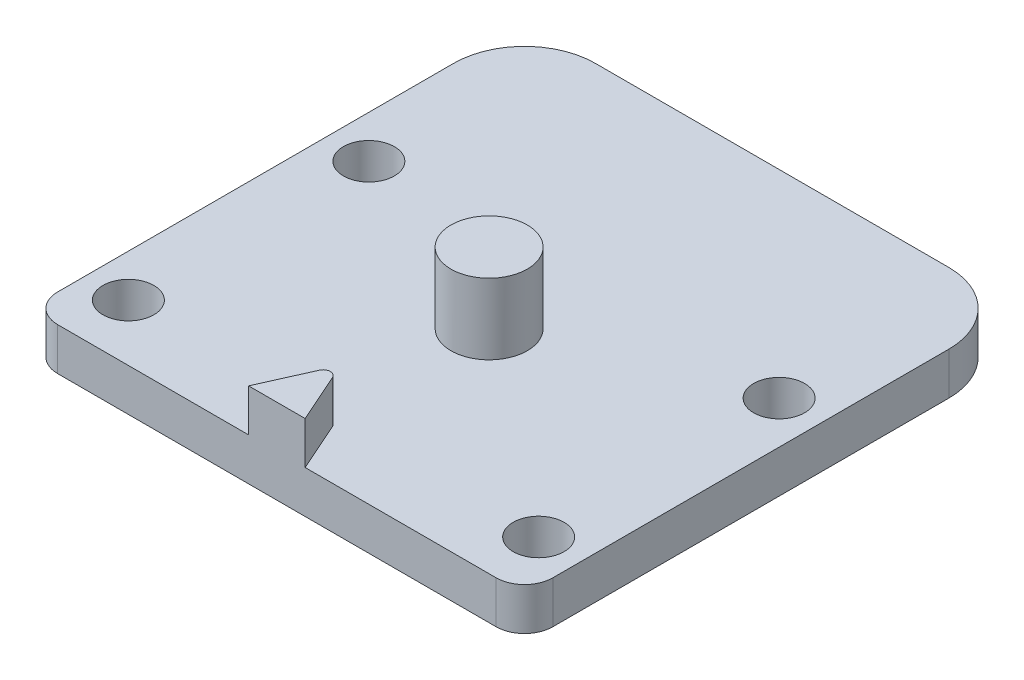
ISO-10303-21;
HEADER;
FILE_DESCRIPTION(('STEP AP214'),'2;1');
FILE_NAME('part.step','',(''),(''),'','','');
FILE_SCHEMA(('AUTOMOTIVE_DESIGN { 1 0 10303 214 1 1 1 1 }'));
ENDSEC;
DATA;
#1=APPLICATION_CONTEXT('core data for automotive mechanical design processes');
#2=APPLICATION_PROTOCOL_DEFINITION('international standard','automotive_design',2000,#1);
#3=PRODUCT_CONTEXT('',#1,'mechanical');
#4=PRODUCT('Part','Part','',(#3));
#5=PRODUCT_RELATED_PRODUCT_CATEGORY('part','',(#4));
#6=PRODUCT_DEFINITION_FORMATION('','',#4);
#7=PRODUCT_DEFINITION_CONTEXT('part definition',#1,'design');
#8=PRODUCT_DEFINITION('design','',#6,#7);
#9=PRODUCT_DEFINITION_SHAPE('','',#8);
#10=(LENGTH_UNIT() NAMED_UNIT(*) SI_UNIT(.MILLI.,.METRE.));
#11=(NAMED_UNIT(*) PLANE_ANGLE_UNIT() SI_UNIT($,.RADIAN.));
#12=(NAMED_UNIT(*) SI_UNIT($,.STERADIAN.) SOLID_ANGLE_UNIT());
#13=UNCERTAINTY_MEASURE_WITH_UNIT(LENGTH_MEASURE(1.E-05),#10,'distance_accuracy_value','');
#14=(GEOMETRIC_REPRESENTATION_CONTEXT(3) GLOBAL_UNCERTAINTY_ASSIGNED_CONTEXT((#13)) GLOBAL_UNIT_ASSIGNED_CONTEXT((#10,
#11,#12)) REPRESENTATION_CONTEXT('',''));
#15=CARTESIAN_POINT('',(0.,0.,0.));
#16=DIRECTION('',(0.,0.,1.));
#17=DIRECTION('',(1.,0.,0.));
#18=AXIS2_PLACEMENT_3D('',#15,#16,#17);
#19=CARTESIAN_POINT('',(0.,3.,0.));
#20=DIRECTION('',(0.,-1.,0.));
#21=DIRECTION('',(0.,0.,-1.));
#22=AXIS2_PLACEMENT_3D('',#19,#20,#21);
#23=PLANE('',#22);
#24=CARTESIAN_POINT('',(3.,3.,-21.));
#25=DIRECTION('',(0.,1.,0.));
#26=DIRECTION('',(0.,0.,1.));
#27=AXIS2_PLACEMENT_3D('',#24,#25,#26);
#28=CIRCLE('',#27,1.8);
#29=CARTESIAN_POINT('',(3.,3.,-19.2));
#30=VERTEX_POINT('',#29);
#31=EDGE_CURVE('E178',#30,#30,#28,.T.);
#32=ORIENTED_EDGE('',*,*,#31,.F.);
#33=EDGE_LOOP('',(#32));
#34=FACE_BOUND('',#33,.T.);
#35=CARTESIAN_POINT('',(3.,3.,-4.));
#36=DIRECTION('',(0.,-1.,0.));
#37=DIRECTION('',(0.,0.,-1.));
#38=AXIS2_PLACEMENT_3D('',#35,#36,#37);
#39=CIRCLE('',#38,1.8);
#40=CARTESIAN_POINT('',(3.,3.,-5.8));
#41=VERTEX_POINT('',#40);
#42=EDGE_CURVE('E172',#41,#41,#39,.T.);
#43=ORIENTED_EDGE('',*,*,#42,.T.);
#44=EDGE_LOOP('',(#43));
#45=FACE_BOUND('',#44,.T.);
#46=CARTESIAN_POINT('',(32.,3.,-21.));
#47=DIRECTION('',(0.,-1.,0.));
#48=DIRECTION('',(0.,0.,1.));
#49=AXIS2_PLACEMENT_3D('',#46,#47,#48);
#50=CIRCLE('',#49,1.8);
#51=CARTESIAN_POINT('',(32.,3.,-19.2));
#52=VERTEX_POINT('',#51);
#53=EDGE_CURVE('E166',#52,#52,#50,.T.);
#54=ORIENTED_EDGE('',*,*,#53,.T.);
#55=EDGE_LOOP('',(#54));
#56=FACE_BOUND('',#55,.T.);
#57=CARTESIAN_POINT('',(32.,3.,-4.));
#58=DIRECTION('',(0.,1.,0.));
#59=DIRECTION('',(0.,0.,-1.));
#60=AXIS2_PLACEMENT_3D('',#57,#58,#59);
#61=CIRCLE('',#60,1.8);
#62=CARTESIAN_POINT('',(32.,3.,-5.8));
#63=VERTEX_POINT('',#62);
#64=EDGE_CURVE('E162',#63,#63,#61,.T.);
#65=ORIENTED_EDGE('',*,*,#64,.F.);
#66=EDGE_LOOP('',(#65));
#67=FACE_BOUND('',#66,.T.);
#68=CARTESIAN_POINT('',(17.5,3.,-15.));
#69=DIRECTION('',(0.,-1.,0.));
#70=DIRECTION('',(0.,0.,-1.));
#71=AXIS2_PLACEMENT_3D('',#68,#69,#70);
#72=CIRCLE('',#71,2.7);
#73=CARTESIAN_POINT('',(17.5,3.,-17.7));
#74=VERTEX_POINT('',#73);
#75=EDGE_CURVE('E197',#74,#74,#72,.F.);
#76=ORIENTED_EDGE('',*,*,#75,.F.);
#77=EDGE_LOOP('',(#76));
#78=FACE_BOUND('',#77,.T.);
#79=DIRECTION('',(-1.,0.,0.));
#80=VECTOR('',#79,1.);
#81=CARTESIAN_POINT('',(0.,3.,-35.));
#82=LINE('',#81,#80);
#83=CARTESIAN_POINT('',(30.,3.,-35.));
#84=VERTEX_POINT('',#83);
#85=CARTESIAN_POINT('',(5.,3.,-35.));
#86=VERTEX_POINT('',#85);
#87=EDGE_CURVE('E195',#84,#86,#82,.T.);
#88=ORIENTED_EDGE('',*,*,#87,.T.);
#89=CARTESIAN_POINT('',(5.,3.,-30.));
#90=DIRECTION('',(0.,-1.,0.));
#91=DIRECTION('',(0.,0.,-1.));
#92=AXIS2_PLACEMENT_3D('',#89,#90,#91);
#93=CIRCLE('',#92,5.);
#94=CARTESIAN_POINT('',(0.,3.,-30.));
#95=VERTEX_POINT('',#94);
#96=EDGE_CURVE('E41',#86,#95,#93,.F.);
#97=ORIENTED_EDGE('',*,*,#96,.T.);
#98=DIRECTION('',(0.,0.,1.));
#99=VECTOR('',#98,1.);
#100=CARTESIAN_POINT('',(0.,3.,0.));
#101=LINE('',#100,#99);
#102=CARTESIAN_POINT('',(0.,3.,-2.));
#103=VERTEX_POINT('',#102);
#104=EDGE_CURVE('E187',#95,#103,#101,.T.);
#105=ORIENTED_EDGE('',*,*,#104,.T.);
#106=CARTESIAN_POINT('',(2.,3.,-2.));
#107=DIRECTION('',(0.,-1.,0.));
#108=DIRECTION('',(0.,0.,-1.));
#109=AXIS2_PLACEMENT_3D('',#106,#107,#108);
#110=CIRCLE('',#109,2.);
#111=CARTESIAN_POINT('',(2.,3.,0.));
#112=VERTEX_POINT('',#111);
#113=EDGE_CURVE('E226',#103,#112,#110,.F.);
#114=ORIENTED_EDGE('',*,*,#113,.T.);
#115=DIRECTION('',(1.,0.,0.));
#116=VECTOR('',#115,1.);
#117=CARTESIAN_POINT('',(0.,3.,0.));
#118=LINE('',#117,#116);
#119=CARTESIAN_POINT('',(15.5,3.,0.));
#120=VERTEX_POINT('',#119);
#121=EDGE_CURVE('E191',#112,#120,#118,.T.);
#122=ORIENTED_EDGE('',*,*,#121,.T.);
#123=DIRECTION('',(-0.406138466053448,0.,0.913811548620257));
#124=VECTOR('',#123,1.);
#125=CARTESIAN_POINT('',(17.5,3.,-4.5));
#126=LINE('',#125,#124);
#127=CARTESIAN_POINT('',(17.0430942256899,3.,-3.47196200780221));
#128=VERTEX_POINT('',#127);
#129=EDGE_CURVE('E142',#128,#120,#126,.T.);
#130=ORIENTED_EDGE('',*,*,#129,.F.);
#131=CARTESIAN_POINT('',(17.5,3.,-3.26889277477549));
#132=DIRECTION('',(0.,-1.,0.));
#133=DIRECTION('',(0.,0.,-1.));
#134=AXIS2_PLACEMENT_3D('',#131,#132,#133);
#135=CIRCLE('',#134,0.5);
#136=CARTESIAN_POINT('',(17.9569057743101,3.,-3.47196200780221));
#137=VERTEX_POINT('',#136);
#138=EDGE_CURVE('E211',#128,#137,#135,.T.);
#139=ORIENTED_EDGE('',*,*,#138,.T.);
#140=DIRECTION('',(-0.406138466053447,0.,-0.913811548620257));
#141=VECTOR('',#140,1.);
#142=CARTESIAN_POINT('',(19.5,3.,0.));
#143=LINE('',#142,#141);
#144=CARTESIAN_POINT('',(19.5,3.,0.));
#145=VERTEX_POINT('',#144);
#146=EDGE_CURVE('E156',#145,#137,#143,.T.);
#147=ORIENTED_EDGE('',*,*,#146,.F.);
#148=CARTESIAN_POINT('',(33.,3.,0.));
#149=VERTEX_POINT('',#148);
#150=EDGE_CURVE('E189',#145,#149,#118,.T.);
#151=ORIENTED_EDGE('',*,*,#150,.T.);
#152=CARTESIAN_POINT('',(33.,3.,-2.));
#153=DIRECTION('',(0.,-1.,0.));
#154=DIRECTION('',(0.,0.,-1.));
#155=AXIS2_PLACEMENT_3D('',#152,#153,#154);
#156=CIRCLE('',#155,2.);
#157=CARTESIAN_POINT('',(35.,3.,-2.));
#158=VERTEX_POINT('',#157);
#159=EDGE_CURVE('E228',#149,#158,#156,.F.);
#160=ORIENTED_EDGE('',*,*,#159,.T.);
#161=DIRECTION('',(0.,0.,-1.));
#162=VECTOR('',#161,1.);
#163=CARTESIAN_POINT('',(35.,3.,0.));
#164=LINE('',#163,#162);
#165=CARTESIAN_POINT('',(35.,3.,-30.));
#166=VERTEX_POINT('',#165);
#167=EDGE_CURVE('E193',#158,#166,#164,.T.);
#168=ORIENTED_EDGE('',*,*,#167,.T.);
#169=CARTESIAN_POINT('',(30.,3.,-30.));
#170=DIRECTION('',(0.,-1.,0.));
#171=DIRECTION('',(0.,0.,-1.));
#172=AXIS2_PLACEMENT_3D('',#169,#170,#171);
#173=CIRCLE('',#172,5.);
#174=EDGE_CURVE('E244',#166,#84,#173,.F.);
#175=ORIENTED_EDGE('',*,*,#174,.T.);
#176=EDGE_LOOP('',(#88,#97,#105,#114,#122,#130,#139,#147,#151,#160,#168,#175));
#177=FACE_BOUND('',#176,.T.);
#178=ADVANCED_FACE('F33',(#34,#45,#56,#67,#78,#177),#23,.F.);
#179=CARTESIAN_POINT('',(0.,3.,0.));
#180=DIRECTION('',(1.,0.,0.));
#181=DIRECTION('',(0.,0.,-1.));
#182=AXIS2_PLACEMENT_3D('',#179,#180,#181);
#183=PLANE('',#182);
#184=ORIENTED_EDGE('',*,*,#104,.F.);
#185=DIRECTION('',(0.,-1.,0.));
#186=VECTOR('',#185,1.);
#187=CARTESIAN_POINT('',(0.,3.,-30.));
#188=LINE('',#187,#186);
#189=CARTESIAN_POINT('',(0.,0.,-30.));
#190=VERTEX_POINT('',#189);
#191=EDGE_CURVE('E233',#95,#190,#188,.T.);
#192=ORIENTED_EDGE('',*,*,#191,.T.);
#193=DIRECTION('',(0.,0.,1.));
#194=VECTOR('',#193,1.);
#195=CARTESIAN_POINT('',(0.,0.,0.));
#196=LINE('',#195,#194);
#197=CARTESIAN_POINT('',(0.,0.,-2.));
#198=VERTEX_POINT('',#197);
#199=EDGE_CURVE('E184',#190,#198,#196,.T.);
#200=ORIENTED_EDGE('',*,*,#199,.T.);
#201=DIRECTION('',(0.,-1.,0.));
#202=VECTOR('',#201,1.);
#203=CARTESIAN_POINT('',(0.,3.,-2.));
#204=LINE('',#203,#202);
#205=EDGE_CURVE('E230',#198,#103,#204,.F.);
#206=ORIENTED_EDGE('',*,*,#205,.T.);
#207=EDGE_LOOP('',(#184,#192,#200,#206));
#208=FACE_BOUND('',#207,.T.);
#209=ADVANCED_FACE('F251',(#208),#183,.F.);
#210=CARTESIAN_POINT('',(0.,3.,0.));
#211=DIRECTION('',(0.,0.,-1.));
#212=DIRECTION('',(-1.,0.,0.));
#213=AXIS2_PLACEMENT_3D('',#210,#211,#212);
#214=PLANE('',#213);
#215=DIRECTION('',(1.,0.,0.));
#216=VECTOR('',#215,1.);
#217=CARTESIAN_POINT('',(0.,0.,0.));
#218=LINE('',#217,#216);
#219=CARTESIAN_POINT('',(2.,0.,0.));
#220=VERTEX_POINT('',#219);
#221=CARTESIAN_POINT('',(33.,0.,0.));
#222=VERTEX_POINT('',#221);
#223=EDGE_CURVE('E199',#220,#222,#218,.T.);
#224=ORIENTED_EDGE('',*,*,#223,.T.);
#225=DIRECTION('',(0.,-1.,0.));
#226=VECTOR('',#225,1.);
#227=CARTESIAN_POINT('',(33.,3.,0.));
#228=LINE('',#227,#226);
#229=EDGE_CURVE('E224',#222,#149,#228,.F.);
#230=ORIENTED_EDGE('',*,*,#229,.T.);
#231=ORIENTED_EDGE('',*,*,#150,.F.);
#232=DIRECTION('',(0.,-1.,0.));
#233=VECTOR('',#232,1.);
#234=CARTESIAN_POINT('',(19.5,6.,0.));
#235=LINE('',#234,#233);
#236=CARTESIAN_POINT('',(19.5,6.,0.));
#237=VERTEX_POINT('',#236);
#238=EDGE_CURVE('E146',#237,#145,#235,.T.);
#239=ORIENTED_EDGE('',*,*,#238,.F.);
#240=DIRECTION('',(1.,0.,0.));
#241=VECTOR('',#240,1.);
#242=CARTESIAN_POINT('',(15.5,6.,0.));
#243=LINE('',#242,#241);
#244=CARTESIAN_POINT('',(15.5,6.,0.));
#245=VERTEX_POINT('',#244);
#246=EDGE_CURVE('E128',#245,#237,#243,.T.);
#247=ORIENTED_EDGE('',*,*,#246,.F.);
#248=DIRECTION('',(0.,-1.,0.));
#249=VECTOR('',#248,1.);
#250=CARTESIAN_POINT('',(15.5,6.,0.));
#251=LINE('',#250,#249);
#252=EDGE_CURVE('E139',#245,#120,#251,.T.);
#253=ORIENTED_EDGE('',*,*,#252,.T.);
#254=ORIENTED_EDGE('',*,*,#121,.F.);
#255=DIRECTION('',(0.,-1.,0.));
#256=VECTOR('',#255,1.);
#257=CARTESIAN_POINT('',(2.,3.,0.));
#258=LINE('',#257,#256);
#259=EDGE_CURVE('E221',#112,#220,#258,.T.);
#260=ORIENTED_EDGE('',*,*,#259,.T.);
#261=EDGE_LOOP('',(#224,#230,#231,#239,#247,#253,#254,#260));
#262=FACE_BOUND('',#261,.T.);
#263=ADVANCED_FACE('F149',(#262),#214,.F.);
#264=CARTESIAN_POINT('',(35.,3.,0.));
#265=DIRECTION('',(-1.,0.,0.));
#266=DIRECTION('',(0.,0.,1.));
#267=AXIS2_PLACEMENT_3D('',#264,#265,#266);
#268=PLANE('',#267);
#269=DIRECTION('',(0.,0.,-1.));
#270=VECTOR('',#269,1.);
#271=CARTESIAN_POINT('',(35.,0.,0.));
#272=LINE('',#271,#270);
#273=CARTESIAN_POINT('',(35.,0.,-2.));
#274=VERTEX_POINT('',#273);
#275=CARTESIAN_POINT('',(35.,0.,-30.));
#276=VERTEX_POINT('',#275);
#277=EDGE_CURVE('E201',#274,#276,#272,.T.);
#278=ORIENTED_EDGE('',*,*,#277,.T.);
#279=DIRECTION('',(0.,-1.,0.));
#280=VECTOR('',#279,1.);
#281=CARTESIAN_POINT('',(35.,3.,-30.));
#282=LINE('',#281,#280);
#283=EDGE_CURVE('E11',#276,#166,#282,.F.);
#284=ORIENTED_EDGE('',*,*,#283,.T.);
#285=ORIENTED_EDGE('',*,*,#167,.F.);
#286=DIRECTION('',(0.,-1.,0.));
#287=VECTOR('',#286,1.);
#288=CARTESIAN_POINT('',(35.,3.,-2.));
#289=LINE('',#288,#287);
#290=EDGE_CURVE('E213',#158,#274,#289,.T.);
#291=ORIENTED_EDGE('',*,*,#290,.T.);
#292=EDGE_LOOP('',(#278,#284,#285,#291));
#293=FACE_BOUND('',#292,.T.);
#294=ADVANCED_FACE('F264',(#293),#268,.F.);
#295=CARTESIAN_POINT('',(0.,3.,-35.));
#296=DIRECTION('',(0.,0.,1.));
#297=DIRECTION('',(1.,0.,0.));
#298=AXIS2_PLACEMENT_3D('',#295,#296,#297);
#299=PLANE('',#298);
#300=DIRECTION('',(-1.,0.,0.));
#301=VECTOR('',#300,1.);
#302=CARTESIAN_POINT('',(0.,0.,-35.));
#303=LINE('',#302,#301);
#304=CARTESIAN_POINT('',(30.,0.,-35.));
#305=VERTEX_POINT('',#304);
#306=CARTESIAN_POINT('',(5.,0.,-35.));
#307=VERTEX_POINT('',#306);
#308=EDGE_CURVE('E190',#305,#307,#303,.T.);
#309=ORIENTED_EDGE('',*,*,#308,.T.);
#310=DIRECTION('',(0.,-1.,0.));
#311=VECTOR('',#310,1.);
#312=CARTESIAN_POINT('',(5.,3.,-35.));
#313=LINE('',#312,#311);
#314=EDGE_CURVE('E54',#307,#86,#313,.F.);
#315=ORIENTED_EDGE('',*,*,#314,.T.);
#316=ORIENTED_EDGE('',*,*,#87,.F.);
#317=DIRECTION('',(0.,-1.,0.));
#318=VECTOR('',#317,1.);
#319=CARTESIAN_POINT('',(30.,3.,-35.));
#320=LINE('',#319,#318);
#321=EDGE_CURVE('E240',#84,#305,#320,.T.);
#322=ORIENTED_EDGE('',*,*,#321,.T.);
#323=EDGE_LOOP('',(#309,#315,#316,#322));
#324=FACE_BOUND('',#323,.T.);
#325=ADVANCED_FACE('F259',(#324),#299,.F.);
#326=CARTESIAN_POINT('',(0.,0.,0.));
#327=DIRECTION('',(0.,-1.,0.));
#328=DIRECTION('',(0.,0.,-1.));
#329=AXIS2_PLACEMENT_3D('',#326,#327,#328);
#330=PLANE('',#329);
#331=CARTESIAN_POINT('',(32.,0.,-4.));
#332=DIRECTION('',(0.,1.,0.));
#333=DIRECTION('',(0.,0.,-1.));
#334=AXIS2_PLACEMENT_3D('',#331,#332,#333);
#335=CIRCLE('',#334,1.8);
#336=CARTESIAN_POINT('',(32.,0.,-5.8));
#337=VERTEX_POINT('',#336);
#338=EDGE_CURVE('E163',#337,#337,#335,.T.);
#339=ORIENTED_EDGE('',*,*,#338,.T.);
#340=EDGE_LOOP('',(#339));
#341=FACE_BOUND('',#340,.T.);
#342=CARTESIAN_POINT('',(32.,0.,-21.));
#343=DIRECTION('',(0.,-1.,0.));
#344=DIRECTION('',(0.,0.,1.));
#345=AXIS2_PLACEMENT_3D('',#342,#343,#344);
#346=CIRCLE('',#345,1.8);
#347=CARTESIAN_POINT('',(32.,0.,-19.2));
#348=VERTEX_POINT('',#347);
#349=EDGE_CURVE('E169',#348,#348,#346,.T.);
#350=ORIENTED_EDGE('',*,*,#349,.F.);
#351=EDGE_LOOP('',(#350));
#352=FACE_BOUND('',#351,.T.);
#353=CARTESIAN_POINT('',(3.,0.,-4.));
#354=DIRECTION('',(0.,-1.,0.));
#355=DIRECTION('',(0.,0.,-1.));
#356=AXIS2_PLACEMENT_3D('',#353,#354,#355);
#357=CIRCLE('',#356,1.8);
#358=CARTESIAN_POINT('',(3.,0.,-5.8));
#359=VERTEX_POINT('',#358);
#360=EDGE_CURVE('E175',#359,#359,#357,.T.);
#361=ORIENTED_EDGE('',*,*,#360,.F.);
#362=EDGE_LOOP('',(#361));
#363=FACE_BOUND('',#362,.T.);
#364=CARTESIAN_POINT('',(3.,0.,-21.));
#365=DIRECTION('',(0.,1.,0.));
#366=DIRECTION('',(0.,0.,1.));
#367=AXIS2_PLACEMENT_3D('',#364,#365,#366);
#368=CIRCLE('',#367,1.8);
#369=CARTESIAN_POINT('',(3.,0.,-19.2));
#370=VERTEX_POINT('',#369);
#371=EDGE_CURVE('E181',#370,#370,#368,.T.);
#372=ORIENTED_EDGE('',*,*,#371,.T.);
#373=EDGE_LOOP('',(#372));
#374=FACE_BOUND('',#373,.T.);
#375=ORIENTED_EDGE('',*,*,#199,.F.);
#376=CARTESIAN_POINT('',(5.,0.,-30.));
#377=DIRECTION('',(0.,-1.,0.));
#378=DIRECTION('',(0.,0.,-1.));
#379=AXIS2_PLACEMENT_3D('',#376,#377,#378);
#380=CIRCLE('',#379,5.);
#381=EDGE_CURVE('E238',#190,#307,#380,.T.);
#382=ORIENTED_EDGE('',*,*,#381,.T.);
#383=ORIENTED_EDGE('',*,*,#308,.F.);
#384=CARTESIAN_POINT('',(30.,0.,-30.));
#385=DIRECTION('',(0.,-1.,0.));
#386=DIRECTION('',(0.,0.,-1.));
#387=AXIS2_PLACEMENT_3D('',#384,#385,#386);
#388=CIRCLE('',#387,5.);
#389=EDGE_CURVE('E236',#305,#276,#388,.T.);
#390=ORIENTED_EDGE('',*,*,#389,.T.);
#391=ORIENTED_EDGE('',*,*,#277,.F.);
#392=CARTESIAN_POINT('',(33.,0.,-2.));
#393=DIRECTION('',(0.,-1.,0.));
#394=DIRECTION('',(0.,0.,-1.));
#395=AXIS2_PLACEMENT_3D('',#392,#393,#394);
#396=CIRCLE('',#395,2.);
#397=EDGE_CURVE('E219',#274,#222,#396,.T.);
#398=ORIENTED_EDGE('',*,*,#397,.T.);
#399=ORIENTED_EDGE('',*,*,#223,.F.);
#400=CARTESIAN_POINT('',(2.,0.,-2.));
#401=DIRECTION('',(0.,-1.,0.));
#402=DIRECTION('',(0.,0.,-1.));
#403=AXIS2_PLACEMENT_3D('',#400,#401,#402);
#404=CIRCLE('',#403,2.);
#405=EDGE_CURVE('E216',#220,#198,#404,.T.);
#406=ORIENTED_EDGE('',*,*,#405,.T.);
#407=EDGE_LOOP('',(#375,#382,#383,#390,#391,#398,#399,#406));
#408=FACE_BOUND('',#407,.T.);
#409=ADVANCED_FACE('F258',(#341,#352,#363,#374,#408),#330,.T.);
#410=CARTESIAN_POINT('',(3.,0.,-21.));
#411=DIRECTION('',(0.,1.,0.));
#412=DIRECTION('',(0.,0.,1.));
#413=AXIS2_PLACEMENT_3D('',#410,#411,#412);
#414=CYLINDRICAL_SURFACE('',#413,1.8);
#415=ORIENTED_EDGE('',*,*,#371,.F.);
#416=EDGE_LOOP('',(#415));
#417=FACE_BOUND('',#416,.T.);
#418=ORIENTED_EDGE('',*,*,#31,.T.);
#419=EDGE_LOOP('',(#418));
#420=FACE_BOUND('',#419,.T.);
#421=ADVANCED_FACE('F300',(#417,#420),#414,.F.);
#422=CARTESIAN_POINT('',(3.,0.,-4.));
#423=DIRECTION('',(0.,1.,0.));
#424=DIRECTION('',(0.,0.,1.));
#425=AXIS2_PLACEMENT_3D('',#422,#423,#424);
#426=CYLINDRICAL_SURFACE('',#425,1.8);
#427=ORIENTED_EDGE('',*,*,#360,.T.);
#428=EDGE_LOOP('',(#427));
#429=FACE_BOUND('',#428,.T.);
#430=ORIENTED_EDGE('',*,*,#42,.F.);
#431=EDGE_LOOP('',(#430));
#432=FACE_BOUND('',#431,.T.);
#433=ADVANCED_FACE('F334',(#429,#432),#426,.F.);
#434=CARTESIAN_POINT('',(32.,0.,-21.));
#435=DIRECTION('',(0.,1.,0.));
#436=DIRECTION('',(0.,0.,1.));
#437=AXIS2_PLACEMENT_3D('',#434,#435,#436);
#438=CYLINDRICAL_SURFACE('',#437,1.8);
#439=ORIENTED_EDGE('',*,*,#349,.T.);
#440=EDGE_LOOP('',(#439));
#441=FACE_BOUND('',#440,.T.);
#442=ORIENTED_EDGE('',*,*,#53,.F.);
#443=EDGE_LOOP('',(#442));
#444=FACE_BOUND('',#443,.T.);
#445=ADVANCED_FACE('F341',(#441,#444),#438,.F.);
#446=CARTESIAN_POINT('',(32.,0.,-4.));
#447=DIRECTION('',(0.,1.,0.));
#448=DIRECTION('',(0.,0.,1.));
#449=AXIS2_PLACEMENT_3D('',#446,#447,#448);
#450=CYLINDRICAL_SURFACE('',#449,1.8);
#451=ORIENTED_EDGE('',*,*,#338,.F.);
#452=EDGE_LOOP('',(#451));
#453=FACE_BOUND('',#452,.T.);
#454=ORIENTED_EDGE('',*,*,#64,.T.);
#455=EDGE_LOOP('',(#454));
#456=FACE_BOUND('',#455,.T.);
#457=ADVANCED_FACE('F348',(#453,#456),#450,.F.);
#458=CARTESIAN_POINT('',(17.5,8.,-15.));
#459=DIRECTION('',(0.,-1.,0.));
#460=DIRECTION('',(0.,0.,-1.));
#461=AXIS2_PLACEMENT_3D('',#458,#459,#460);
#462=CYLINDRICAL_SURFACE('',#461,2.7);
#463=CARTESIAN_POINT('',(17.5,8.,-15.));
#464=DIRECTION('',(0.,1.,0.));
#465=DIRECTION('',(0.,0.,1.));
#466=AXIS2_PLACEMENT_3D('',#463,#464,#465);
#467=CIRCLE('',#466,2.7);
#468=CARTESIAN_POINT('',(17.5,8.,-12.3));
#469=VERTEX_POINT('',#468);
#470=EDGE_CURVE('E145',#469,#469,#467,.T.);
#471=ORIENTED_EDGE('',*,*,#470,.F.);
#472=EDGE_LOOP('',(#471));
#473=FACE_BOUND('',#472,.T.);
#474=ORIENTED_EDGE('',*,*,#75,.T.);
#475=EDGE_LOOP('',(#474));
#476=FACE_BOUND('',#475,.T.);
#477=ADVANCED_FACE('F356',(#473,#476),#462,.T.);
#478=CARTESIAN_POINT('',(17.5,8.,-15.));
#479=DIRECTION('',(0.,1.,0.));
#480=DIRECTION('',(0.,0.,1.));
#481=AXIS2_PLACEMENT_3D('',#478,#479,#480);
#482=PLANE('',#481);
#483=ORIENTED_EDGE('',*,*,#470,.T.);
#484=EDGE_LOOP('',(#483));
#485=FACE_BOUND('',#484,.T.);
#486=ADVANCED_FACE('F364',(#485),#482,.T.);
#487=CARTESIAN_POINT('',(19.5,6.,0.));
#488=DIRECTION('',(-0.913811548620257,0.,0.406138466053447));
#489=DIRECTION('',(0.406138466053447,0.,0.913811548620257));
#490=AXIS2_PLACEMENT_3D('',#487,#488,#489);
#491=PLANE('',#490);
#492=ORIENTED_EDGE('',*,*,#146,.T.);
#493=DIRECTION('',(0.,-1.,0.));
#494=VECTOR('',#493,1.);
#495=CARTESIAN_POINT('',(17.9569057743101,6.,-3.47196200780221));
#496=LINE('',#495,#494);
#497=CARTESIAN_POINT('',(17.9569057743101,6.,-3.47196200780221));
#498=VERTEX_POINT('',#497);
#499=EDGE_CURVE('E208',#137,#498,#496,.F.);
#500=ORIENTED_EDGE('',*,*,#499,.T.);
#501=DIRECTION('',(-0.406138466053447,0.,-0.913811548620257));
#502=VECTOR('',#501,1.);
#503=CARTESIAN_POINT('',(19.5,6.,0.));
#504=LINE('',#503,#502);
#505=EDGE_CURVE('E135',#237,#498,#504,.T.);
#506=ORIENTED_EDGE('',*,*,#505,.F.);
#507=ORIENTED_EDGE('',*,*,#238,.T.);
#508=EDGE_LOOP('',(#492,#500,#506,#507));
#509=FACE_BOUND('',#508,.T.);
#510=ADVANCED_FACE('F279',(#509),#491,.F.);
#511=CARTESIAN_POINT('',(17.5,6.,-4.5));
#512=DIRECTION('',(0.913811548620257,0.,0.406138466053448));
#513=DIRECTION('',(0.406138466053448,0.,-0.913811548620257));
#514=AXIS2_PLACEMENT_3D('',#511,#512,#513);
#515=PLANE('',#514);
#516=DIRECTION('',(-0.406138466053448,0.,0.913811548620257));
#517=VECTOR('',#516,1.);
#518=CARTESIAN_POINT('',(17.5,6.,-4.5));
#519=LINE('',#518,#517);
#520=CARTESIAN_POINT('',(17.0430942256899,6.,-3.47196200780221));
#521=VERTEX_POINT('',#520);
#522=EDGE_CURVE('E123',#521,#245,#519,.T.);
#523=ORIENTED_EDGE('',*,*,#522,.F.);
#524=DIRECTION('',(0.,-1.,0.));
#525=VECTOR('',#524,1.);
#526=CARTESIAN_POINT('',(17.0430942256899,6.,-3.47196200780221));
#527=LINE('',#526,#525);
#528=EDGE_CURVE('E206',#521,#128,#527,.T.);
#529=ORIENTED_EDGE('',*,*,#528,.T.);
#530=ORIENTED_EDGE('',*,*,#129,.T.);
#531=ORIENTED_EDGE('',*,*,#252,.F.);
#532=EDGE_LOOP('',(#523,#529,#530,#531));
#533=FACE_BOUND('',#532,.T.);
#534=ADVANCED_FACE('F140',(#533),#515,.F.);
#535=CARTESIAN_POINT('',(0.,6.,0.));
#536=DIRECTION('',(0.,-1.,0.));
#537=DIRECTION('',(0.,0.,-1.));
#538=AXIS2_PLACEMENT_3D('',#535,#536,#537);
#539=PLANE('',#538);
#540=ORIENTED_EDGE('',*,*,#505,.T.);
#541=CARTESIAN_POINT('',(17.5,6.,-3.26889277477549));
#542=DIRECTION('',(0.,-1.,0.));
#543=DIRECTION('',(0.,0.,-1.));
#544=AXIS2_PLACEMENT_3D('',#541,#542,#543);
#545=CIRCLE('',#544,0.5);
#546=EDGE_CURVE('E131',#498,#521,#545,.F.);
#547=ORIENTED_EDGE('',*,*,#546,.T.);
#548=ORIENTED_EDGE('',*,*,#522,.T.);
#549=ORIENTED_EDGE('',*,*,#246,.T.);
#550=EDGE_LOOP('',(#540,#547,#548,#549));
#551=FACE_BOUND('',#550,.T.);
#552=ADVANCED_FACE('F126',(#551),#539,.F.);
#553=CARTESIAN_POINT('',(17.5,6.,-3.26889277477549));
#554=DIRECTION('',(0.,-1.,0.));
#555=DIRECTION('',(0.,0.,-1.));
#556=AXIS2_PLACEMENT_3D('',#553,#554,#555);
#557=CYLINDRICAL_SURFACE('',#556,0.5);
#558=ORIENTED_EDGE('',*,*,#546,.F.);
#559=ORIENTED_EDGE('',*,*,#499,.F.);
#560=ORIENTED_EDGE('',*,*,#138,.F.);
#561=ORIENTED_EDGE('',*,*,#528,.F.);
#562=EDGE_LOOP('',(#558,#559,#560,#561));
#563=FACE_BOUND('',#562,.T.);
#564=ADVANCED_FACE('F280',(#563),#557,.T.);
#565=CARTESIAN_POINT('',(33.,3.,-2.));
#566=DIRECTION('',(0.,-1.,0.));
#567=DIRECTION('',(0.,0.,-1.));
#568=AXIS2_PLACEMENT_3D('',#565,#566,#567);
#569=CYLINDRICAL_SURFACE('',#568,2.);
#570=ORIENTED_EDGE('',*,*,#159,.F.);
#571=ORIENTED_EDGE('',*,*,#229,.F.);
#572=ORIENTED_EDGE('',*,*,#397,.F.);
#573=ORIENTED_EDGE('',*,*,#290,.F.);
#574=EDGE_LOOP('',(#570,#571,#572,#573));
#575=FACE_BOUND('',#574,.T.);
#576=ADVANCED_FACE('F268',(#575),#569,.T.);
#577=CARTESIAN_POINT('',(2.,3.,-2.));
#578=DIRECTION('',(0.,-1.,0.));
#579=DIRECTION('',(0.,0.,-1.));
#580=AXIS2_PLACEMENT_3D('',#577,#578,#579);
#581=CYLINDRICAL_SURFACE('',#580,2.);
#582=ORIENTED_EDGE('',*,*,#113,.F.);
#583=ORIENTED_EDGE('',*,*,#205,.F.);
#584=ORIENTED_EDGE('',*,*,#405,.F.);
#585=ORIENTED_EDGE('',*,*,#259,.F.);
#586=EDGE_LOOP('',(#582,#583,#584,#585));
#587=FACE_BOUND('',#586,.T.);
#588=ADVANCED_FACE('F274',(#587),#581,.T.);
#589=CARTESIAN_POINT('',(5.,3.,-30.));
#590=DIRECTION('',(0.,-1.,0.));
#591=DIRECTION('',(0.,0.,-1.));
#592=AXIS2_PLACEMENT_3D('',#589,#590,#591);
#593=CYLINDRICAL_SURFACE('',#592,5.);
#594=ORIENTED_EDGE('',*,*,#96,.F.);
#595=ORIENTED_EDGE('',*,*,#314,.F.);
#596=ORIENTED_EDGE('',*,*,#381,.F.);
#597=ORIENTED_EDGE('',*,*,#191,.F.);
#598=EDGE_LOOP('',(#594,#595,#596,#597));
#599=FACE_BOUND('',#598,.T.);
#600=ADVANCED_FACE('F255',(#599),#593,.T.);
#601=CARTESIAN_POINT('',(30.,3.,-30.));
#602=DIRECTION('',(0.,-1.,0.));
#603=DIRECTION('',(0.,0.,-1.));
#604=AXIS2_PLACEMENT_3D('',#601,#602,#603);
#605=CYLINDRICAL_SURFACE('',#604,5.);
#606=ORIENTED_EDGE('',*,*,#174,.F.);
#607=ORIENTED_EDGE('',*,*,#283,.F.);
#608=ORIENTED_EDGE('',*,*,#389,.F.);
#609=ORIENTED_EDGE('',*,*,#321,.F.);
#610=EDGE_LOOP('',(#606,#607,#608,#609));
#611=FACE_BOUND('',#610,.T.);
#612=ADVANCED_FACE('F35',(#611),#605,.T.);
#613=CLOSED_SHELL('',(#178,#209,#263,#294,#325,#409,#421,#433,#445,#457,#477,#486,#510,#534,
#552,#564,#576,#588,#600,#612));
#614=MANIFOLD_SOLID_BREP('B2',#613);
#615=ADVANCED_BREP_SHAPE_REPRESENTATION('',(#18,#614),#14);
#616=SHAPE_DEFINITION_REPRESENTATION(#9,#615);
ENDSEC;
END-ISO-10303-21;
